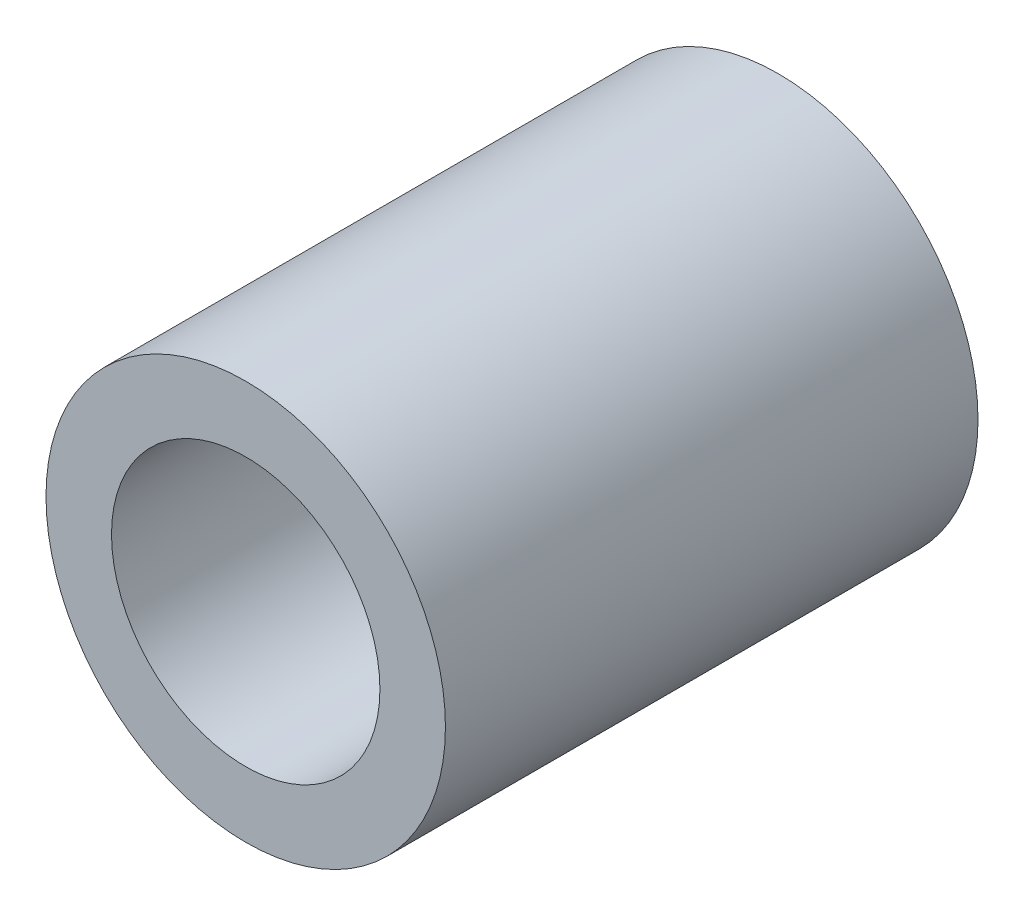
ISO-10303-21;
HEADER;
FILE_DESCRIPTION(('STEP AP214'),'2;1');
FILE_NAME('part.step','',(''),(''),'','','');
FILE_SCHEMA(('AUTOMOTIVE_DESIGN { 1 0 10303 214 1 1 1 1 }'));
ENDSEC;
DATA;
#1=APPLICATION_CONTEXT('core data for automotive mechanical design processes');
#2=APPLICATION_PROTOCOL_DEFINITION('international standard','automotive_design',2000,#1);
#3=PRODUCT_CONTEXT('',#1,'mechanical');
#4=PRODUCT('Part','Part','',(#3));
#5=PRODUCT_RELATED_PRODUCT_CATEGORY('part','',(#4));
#6=PRODUCT_DEFINITION_FORMATION('','',#4);
#7=PRODUCT_DEFINITION_CONTEXT('part definition',#1,'design');
#8=PRODUCT_DEFINITION('design','',#6,#7);
#9=PRODUCT_DEFINITION_SHAPE('','',#8);
#10=(LENGTH_UNIT() NAMED_UNIT(*) SI_UNIT(.MILLI.,.METRE.));
#11=(NAMED_UNIT(*) PLANE_ANGLE_UNIT() SI_UNIT($,.RADIAN.));
#12=(NAMED_UNIT(*) SI_UNIT($,.STERADIAN.) SOLID_ANGLE_UNIT());
#13=UNCERTAINTY_MEASURE_WITH_UNIT(LENGTH_MEASURE(1.E-05),#10,'distance_accuracy_value','');
#14=(GEOMETRIC_REPRESENTATION_CONTEXT(3) GLOBAL_UNCERTAINTY_ASSIGNED_CONTEXT((#13)) GLOBAL_UNIT_ASSIGNED_CONTEXT((#10,
#11,#12)) REPRESENTATION_CONTEXT('',''));
#15=CARTESIAN_POINT('',(0.,0.,0.));
#16=DIRECTION('',(0.,0.,1.));
#17=DIRECTION('',(1.,0.,0.));
#18=AXIS2_PLACEMENT_3D('',#15,#16,#17);
#19=CARTESIAN_POINT('',(0.,0.,6.35));
#20=DIRECTION('',(0.,0.,1.));
#21=DIRECTION('',(1.,0.,0.));
#22=AXIS2_PLACEMENT_3D('',#19,#20,#21);
#23=PLANE('',#22);
#24=CARTESIAN_POINT('',(0.,0.,6.35));
#25=DIRECTION('',(0.,0.,1.));
#26=DIRECTION('',(1.,0.,0.));
#27=AXIS2_PLACEMENT_3D('',#24,#25,#26);
#28=CIRCLE('',#27,4.7625);
#29=CARTESIAN_POINT('',(4.7625,0.,6.35));
#30=VERTEX_POINT('',#29);
#31=EDGE_CURVE('E10',#30,#30,#28,.T.);
#32=ORIENTED_EDGE('',*,*,#31,.T.);
#33=EDGE_LOOP('',(#32));
#34=FACE_BOUND('',#33,.T.);
#35=CARTESIAN_POINT('',(0.,0.,6.35));
#36=DIRECTION('',(0.,0.,1.));
#37=DIRECTION('',(1.,0.,0.));
#38=AXIS2_PLACEMENT_3D('',#35,#36,#37);
#39=CIRCLE('',#38,3.2004);
#40=CARTESIAN_POINT('',(3.2004,0.,6.35));
#41=VERTEX_POINT('',#40);
#42=EDGE_CURVE('E41',#41,#41,#39,.T.);
#43=ORIENTED_EDGE('',*,*,#42,.F.);
#44=EDGE_LOOP('',(#43));
#45=FACE_BOUND('',#44,.T.);
#46=ADVANCED_FACE('F30',(#34,#45),#23,.T.);
#47=CARTESIAN_POINT('',(0.,0.,-6.35));
#48=DIRECTION('',(0.,0.,1.));
#49=DIRECTION('',(1.,0.,0.));
#50=AXIS2_PLACEMENT_3D('',#47,#48,#49);
#51=PLANE('',#50);
#52=CARTESIAN_POINT('',(0.,0.,-6.35));
#53=DIRECTION('',(0.,0.,1.));
#54=DIRECTION('',(1.,0.,0.));
#55=AXIS2_PLACEMENT_3D('',#52,#53,#54);
#56=CIRCLE('',#55,4.7625);
#57=CARTESIAN_POINT('',(4.7625,0.,-6.35));
#58=VERTEX_POINT('',#57);
#59=EDGE_CURVE('E34',#58,#58,#56,.T.);
#60=ORIENTED_EDGE('',*,*,#59,.F.);
#61=EDGE_LOOP('',(#60));
#62=FACE_BOUND('',#61,.T.);
#63=CARTESIAN_POINT('',(0.,0.,-6.35));
#64=DIRECTION('',(0.,0.,1.));
#65=DIRECTION('',(1.,0.,0.));
#66=AXIS2_PLACEMENT_3D('',#63,#64,#65);
#67=CIRCLE('',#66,3.2004);
#68=CARTESIAN_POINT('',(3.2004,0.,-6.35));
#69=VERTEX_POINT('',#68);
#70=EDGE_CURVE('E43',#69,#69,#67,.T.);
#71=ORIENTED_EDGE('',*,*,#70,.T.);
#72=EDGE_LOOP('',(#71));
#73=FACE_BOUND('',#72,.T.);
#74=ADVANCED_FACE('F53',(#62,#73),#51,.F.);
#75=CARTESIAN_POINT('',(0.,0.,6.35));
#76=DIRECTION('',(0.,0.,-1.));
#77=DIRECTION('',(-1.,0.,0.));
#78=AXIS2_PLACEMENT_3D('',#75,#76,#77);
#79=CYLINDRICAL_SURFACE('',#78,4.7625);
#80=ORIENTED_EDGE('',*,*,#31,.F.);
#81=EDGE_LOOP('',(#80));
#82=FACE_BOUND('',#81,.T.);
#83=ORIENTED_EDGE('',*,*,#59,.T.);
#84=EDGE_LOOP('',(#83));
#85=FACE_BOUND('',#84,.T.);
#86=ADVANCED_FACE('F32',(#82,#85),#79,.T.);
#87=CARTESIAN_POINT('',(0.,0.,6.35));
#88=DIRECTION('',(0.,0.,-1.));
#89=DIRECTION('',(-1.,0.,0.));
#90=AXIS2_PLACEMENT_3D('',#87,#88,#89);
#91=CYLINDRICAL_SURFACE('',#90,3.2004);
#92=ORIENTED_EDGE('',*,*,#42,.T.);
#93=EDGE_LOOP('',(#92));
#94=FACE_BOUND('',#93,.T.);
#95=ORIENTED_EDGE('',*,*,#70,.F.);
#96=EDGE_LOOP('',(#95));
#97=FACE_BOUND('',#96,.T.);
#98=ADVANCED_FACE('F49',(#94,#97),#91,.F.);
#99=CLOSED_SHELL('',(#46,#74,#86,#98));
#100=MANIFOLD_SOLID_BREP('B2',#99);
#101=ADVANCED_BREP_SHAPE_REPRESENTATION('',(#18,#100),#14);
#102=SHAPE_DEFINITION_REPRESENTATION(#9,#101);
ENDSEC;
END-ISO-10303-21;
